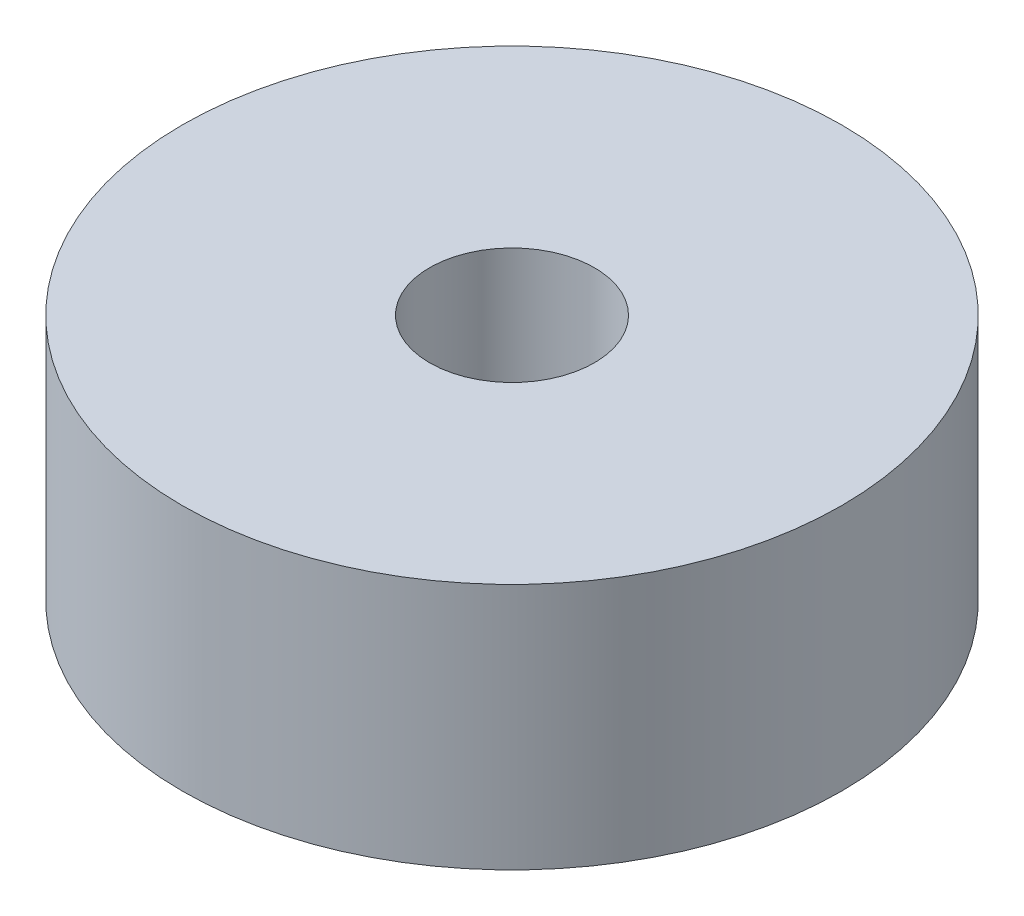
ISO-10303-21;
HEADER;
FILE_DESCRIPTION(('STEP AP214'),'2;1');
FILE_NAME('part.step','',(''),(''),'','','');
FILE_SCHEMA(('AUTOMOTIVE_DESIGN { 1 0 10303 214 1 1 1 1 }'));
ENDSEC;
DATA;
#1=APPLICATION_CONTEXT('core data for automotive mechanical design processes');
#2=APPLICATION_PROTOCOL_DEFINITION('international standard','automotive_design',2000,#1);
#3=PRODUCT_CONTEXT('',#1,'mechanical');
#4=PRODUCT('Part','Part','',(#3));
#5=PRODUCT_RELATED_PRODUCT_CATEGORY('part','',(#4));
#6=PRODUCT_DEFINITION_FORMATION('','',#4);
#7=PRODUCT_DEFINITION_CONTEXT('part definition',#1,'design');
#8=PRODUCT_DEFINITION('design','',#6,#7);
#9=PRODUCT_DEFINITION_SHAPE('','',#8);
#10=(LENGTH_UNIT() NAMED_UNIT(*) SI_UNIT(.MILLI.,.METRE.));
#11=(NAMED_UNIT(*) PLANE_ANGLE_UNIT() SI_UNIT($,.RADIAN.));
#12=(NAMED_UNIT(*) SI_UNIT($,.STERADIAN.) SOLID_ANGLE_UNIT());
#13=UNCERTAINTY_MEASURE_WITH_UNIT(LENGTH_MEASURE(1.E-05),#10,'distance_accuracy_value','');
#14=(GEOMETRIC_REPRESENTATION_CONTEXT(3) GLOBAL_UNCERTAINTY_ASSIGNED_CONTEXT((#13)) GLOBAL_UNIT_ASSIGNED_CONTEXT((#10,
#11,#12)) REPRESENTATION_CONTEXT('',''));
#15=CARTESIAN_POINT('',(0.,0.,0.));
#16=DIRECTION('',(0.,0.,1.));
#17=DIRECTION('',(1.,0.,0.));
#18=AXIS2_PLACEMENT_3D('',#15,#16,#17);
#19=CARTESIAN_POINT('',(0.,3.,0.));
#20=DIRECTION('',(0.,1.,0.));
#21=DIRECTION('',(0.,0.,1.));
#22=AXIS2_PLACEMENT_3D('',#19,#20,#21);
#23=PLANE('',#22);
#24=CARTESIAN_POINT('',(0.,3.,0.));
#25=DIRECTION('',(0.,1.,0.));
#26=DIRECTION('',(0.,0.,1.));
#27=AXIS2_PLACEMENT_3D('',#24,#25,#26);
#28=CIRCLE('',#27,4.);
#29=CARTESIAN_POINT('',(0.,3.,4.));
#30=VERTEX_POINT('',#29);
#31=EDGE_CURVE('E10',#30,#30,#28,.T.);
#32=ORIENTED_EDGE('',*,*,#31,.T.);
#33=EDGE_LOOP('',(#32));
#34=FACE_BOUND('',#33,.T.);
#35=CARTESIAN_POINT('',(0.,3.,0.));
#36=DIRECTION('',(0.,1.,0.));
#37=DIRECTION('',(0.,0.,1.));
#38=AXIS2_PLACEMENT_3D('',#35,#36,#37);
#39=CIRCLE('',#38,1.);
#40=CARTESIAN_POINT('',(0.,3.,1.));
#41=VERTEX_POINT('',#40);
#42=EDGE_CURVE('E54',#41,#41,#39,.T.);
#43=ORIENTED_EDGE('',*,*,#42,.F.);
#44=EDGE_LOOP('',(#43));
#45=FACE_BOUND('',#44,.T.);
#46=ADVANCED_FACE('F41',(#34,#45),#23,.T.);
#47=CARTESIAN_POINT('',(0.,0.,0.));
#48=DIRECTION('',(0.,1.,0.));
#49=DIRECTION('',(0.,0.,1.));
#50=AXIS2_PLACEMENT_3D('',#47,#48,#49);
#51=PLANE('',#50);
#52=CARTESIAN_POINT('',(0.,0.,0.));
#53=DIRECTION('',(0.,1.,0.));
#54=DIRECTION('',(0.,0.,1.));
#55=AXIS2_PLACEMENT_3D('',#52,#53,#54);
#56=CIRCLE('',#55,4.);
#57=CARTESIAN_POINT('',(0.,0.,4.));
#58=VERTEX_POINT('',#57);
#59=EDGE_CURVE('E45',#58,#58,#56,.T.);
#60=ORIENTED_EDGE('',*,*,#59,.F.);
#61=EDGE_LOOP('',(#60));
#62=FACE_BOUND('',#61,.T.);
#63=CARTESIAN_POINT('',(0.,0.,0.));
#64=DIRECTION('',(0.,1.,0.));
#65=DIRECTION('',(0.,0.,1.));
#66=AXIS2_PLACEMENT_3D('',#63,#64,#65);
#67=CIRCLE('',#66,1.);
#68=CARTESIAN_POINT('',(0.,0.,1.));
#69=VERTEX_POINT('',#68);
#70=EDGE_CURVE('E56',#69,#69,#67,.T.);
#71=ORIENTED_EDGE('',*,*,#70,.T.);
#72=EDGE_LOOP('',(#71));
#73=FACE_BOUND('',#72,.T.);
#74=ADVANCED_FACE('F68',(#62,#73),#51,.F.);
#75=CARTESIAN_POINT('',(0.,3.,0.));
#76=DIRECTION('',(0.,-1.,0.));
#77=DIRECTION('',(0.,0.,-1.));
#78=AXIS2_PLACEMENT_3D('',#75,#76,#77);
#79=CYLINDRICAL_SURFACE('',#78,4.);
#80=ORIENTED_EDGE('',*,*,#31,.F.);
#81=EDGE_LOOP('',(#80));
#82=FACE_BOUND('',#81,.T.);
#83=ORIENTED_EDGE('',*,*,#59,.T.);
#84=EDGE_LOOP('',(#83));
#85=FACE_BOUND('',#84,.T.);
#86=ADVANCED_FACE('F43',(#82,#85),#79,.T.);
#87=CARTESIAN_POINT('',(0.,3.,0.));
#88=DIRECTION('',(0.,-1.,0.));
#89=DIRECTION('',(0.,0.,-1.));
#90=AXIS2_PLACEMENT_3D('',#87,#88,#89);
#91=CYLINDRICAL_SURFACE('',#90,1.);
#92=ORIENTED_EDGE('',*,*,#42,.T.);
#93=EDGE_LOOP('',(#92));
#94=FACE_BOUND('',#93,.T.);
#95=ORIENTED_EDGE('',*,*,#70,.F.);
#96=EDGE_LOOP('',(#95));
#97=FACE_BOUND('',#96,.T.);
#98=ADVANCED_FACE('F64',(#94,#97),#91,.F.);
#99=CLOSED_SHELL('',(#46,#74,#86,#98));
#100=MANIFOLD_SOLID_BREP('B2',#99);
#101=ADVANCED_BREP_SHAPE_REPRESENTATION('',(#18,#100),#14);
#102=SHAPE_DEFINITION_REPRESENTATION(#9,#101);
ENDSEC;
END-ISO-10303-21;
